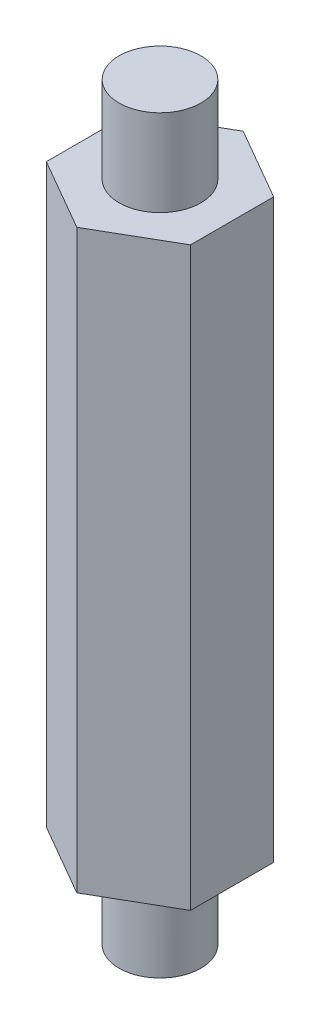
ISO-10303-21;
HEADER;
FILE_DESCRIPTION(('STEP AP214'),'2;1');
FILE_NAME('part.step','',(''),(''),'','','');
FILE_SCHEMA(('AUTOMOTIVE_DESIGN { 1 0 10303 214 1 1 1 1 }'));
ENDSEC;
DATA;
#1=APPLICATION_CONTEXT('core data for automotive mechanical design processes');
#2=APPLICATION_PROTOCOL_DEFINITION('international standard','automotive_design',2000,#1);
#3=PRODUCT_CONTEXT('',#1,'mechanical');
#4=PRODUCT('Part','Part','',(#3));
#5=PRODUCT_RELATED_PRODUCT_CATEGORY('part','',(#4));
#6=PRODUCT_DEFINITION_FORMATION('','',#4);
#7=PRODUCT_DEFINITION_CONTEXT('part definition',#1,'design');
#8=PRODUCT_DEFINITION('design','',#6,#7);
#9=PRODUCT_DEFINITION_SHAPE('','',#8);
#10=(LENGTH_UNIT() NAMED_UNIT(*) SI_UNIT(.MILLI.,.METRE.));
#11=(NAMED_UNIT(*) PLANE_ANGLE_UNIT() SI_UNIT($,.RADIAN.));
#12=(NAMED_UNIT(*) SI_UNIT($,.STERADIAN.) SOLID_ANGLE_UNIT());
#13=UNCERTAINTY_MEASURE_WITH_UNIT(LENGTH_MEASURE(1.E-05),#10,'distance_accuracy_value','');
#14=(GEOMETRIC_REPRESENTATION_CONTEXT(3) GLOBAL_UNCERTAINTY_ASSIGNED_CONTEXT((#13)) GLOBAL_UNIT_ASSIGNED_CONTEXT((#10,
#11,#12)) REPRESENTATION_CONTEXT('',''));
#15=CARTESIAN_POINT('',(0.,0.,0.));
#16=DIRECTION('',(0.,0.,1.));
#17=DIRECTION('',(1.,0.,0.));
#18=AXIS2_PLACEMENT_3D('',#15,#16,#17);
#19=CARTESIAN_POINT('',(2.5,20.,-1.44337567297406));
#20=DIRECTION('',(-0.5,0.,0.866025403784438));
#21=DIRECTION('',(0.866025403784439,0.,0.5));
#22=AXIS2_PLACEMENT_3D('',#19,#20,#21);
#23=PLANE('',#22);
#24=DIRECTION('',(-0.866025403784439,0.,-0.5));
#25=VECTOR('',#24,1.);
#26=CARTESIAN_POINT('',(2.5,0.,-1.44337567297406));
#27=LINE('',#26,#25);
#28=CARTESIAN_POINT('',(2.5,0.,-1.44337567297406));
#29=VERTEX_POINT('',#28);
#30=CARTESIAN_POINT('',(0.,0.,-2.88675134594813));
#31=VERTEX_POINT('',#30);
#32=EDGE_CURVE('E121',#29,#31,#27,.T.);
#33=ORIENTED_EDGE('',*,*,#32,.T.);
#34=DIRECTION('',(0.,-1.,0.));
#35=VECTOR('',#34,1.);
#36=CARTESIAN_POINT('',(0.,20.,-2.88675134594813));
#37=LINE('',#36,#35);
#38=CARTESIAN_POINT('',(0.,20.,-2.88675134594813));
#39=VERTEX_POINT('',#38);
#40=EDGE_CURVE('E44',#39,#31,#37,.T.);
#41=ORIENTED_EDGE('',*,*,#40,.F.);
#42=DIRECTION('',(-0.866025403784439,0.,-0.5));
#43=VECTOR('',#42,1.);
#44=CARTESIAN_POINT('',(2.5,20.,-1.44337567297406));
#45=LINE('',#44,#43);
#46=CARTESIAN_POINT('',(2.5,20.,-1.44337567297406));
#47=VERTEX_POINT('',#46);
#48=EDGE_CURVE('E132',#47,#39,#45,.T.);
#49=ORIENTED_EDGE('',*,*,#48,.F.);
#50=DIRECTION('',(0.,-1.,0.));
#51=VECTOR('',#50,1.);
#52=CARTESIAN_POINT('',(2.5,20.,-1.44337567297406));
#53=LINE('',#52,#51);
#54=EDGE_CURVE('E117',#47,#29,#53,.T.);
#55=ORIENTED_EDGE('',*,*,#54,.T.);
#56=EDGE_LOOP('',(#33,#41,#49,#55));
#57=FACE_BOUND('',#56,.T.);
#58=ADVANCED_FACE('F36',(#57),#23,.F.);
#59=CARTESIAN_POINT('',(0.,20.,-2.88675134594813));
#60=DIRECTION('',(0.5,0.,0.866025403784439));
#61=DIRECTION('',(0.866025403784439,0.,-0.5));
#62=AXIS2_PLACEMENT_3D('',#59,#60,#61);
#63=PLANE('',#62);
#64=DIRECTION('',(-0.866025403784439,0.,0.5));
#65=VECTOR('',#64,1.);
#66=CARTESIAN_POINT('',(0.,0.,-2.88675134594813));
#67=LINE('',#66,#65);
#68=CARTESIAN_POINT('',(-2.5,0.,-1.44337567297407));
#69=VERTEX_POINT('',#68);
#70=EDGE_CURVE('E124',#31,#69,#67,.T.);
#71=ORIENTED_EDGE('',*,*,#70,.T.);
#72=DIRECTION('',(0.,-1.,0.));
#73=VECTOR('',#72,1.);
#74=CARTESIAN_POINT('',(-2.5,20.,-1.44337567297407));
#75=LINE('',#74,#73);
#76=CARTESIAN_POINT('',(-2.5,20.,-1.44337567297407));
#77=VERTEX_POINT('',#76);
#78=EDGE_CURVE('E136',#77,#69,#75,.T.);
#79=ORIENTED_EDGE('',*,*,#78,.F.);
#80=DIRECTION('',(-0.866025403784439,0.,0.5));
#81=VECTOR('',#80,1.);
#82=CARTESIAN_POINT('',(0.,20.,-2.88675134594813));
#83=LINE('',#82,#81);
#84=EDGE_CURVE('E90',#39,#77,#83,.T.);
#85=ORIENTED_EDGE('',*,*,#84,.F.);
#86=ORIENTED_EDGE('',*,*,#40,.T.);
#87=EDGE_LOOP('',(#71,#79,#85,#86));
#88=FACE_BOUND('',#87,.T.);
#89=ADVANCED_FACE('F139',(#88),#63,.F.);
#90=CARTESIAN_POINT('',(-2.5,20.,-1.44337567297407));
#91=DIRECTION('',(1.,0.,0.));
#92=DIRECTION('',(0.,0.,-1.));
#93=AXIS2_PLACEMENT_3D('',#90,#91,#92);
#94=PLANE('',#93);
#95=DIRECTION('',(0.,0.,1.));
#96=VECTOR('',#95,1.);
#97=CARTESIAN_POINT('',(-2.5,0.,-1.44337567297407));
#98=LINE('',#97,#96);
#99=CARTESIAN_POINT('',(-2.5,0.,1.44337567297406));
#100=VERTEX_POINT('',#99);
#101=EDGE_CURVE('E127',#69,#100,#98,.T.);
#102=ORIENTED_EDGE('',*,*,#101,.T.);
#103=DIRECTION('',(0.,-1.,0.));
#104=VECTOR('',#103,1.);
#105=CARTESIAN_POINT('',(-2.5,20.,1.44337567297406));
#106=LINE('',#105,#104);
#107=CARTESIAN_POINT('',(-2.5,20.,1.44337567297406));
#108=VERTEX_POINT('',#107);
#109=EDGE_CURVE('E112',#108,#100,#106,.T.);
#110=ORIENTED_EDGE('',*,*,#109,.F.);
#111=DIRECTION('',(0.,0.,1.));
#112=VECTOR('',#111,1.);
#113=CARTESIAN_POINT('',(-2.5,20.,-1.44337567297407));
#114=LINE('',#113,#112);
#115=EDGE_CURVE('E103',#77,#108,#114,.T.);
#116=ORIENTED_EDGE('',*,*,#115,.F.);
#117=ORIENTED_EDGE('',*,*,#78,.T.);
#118=EDGE_LOOP('',(#102,#110,#116,#117));
#119=FACE_BOUND('',#118,.T.);
#120=ADVANCED_FACE('F147',(#119),#94,.F.);
#121=CARTESIAN_POINT('',(-2.5,20.,1.44337567297406));
#122=DIRECTION('',(0.5,0.,-0.866025403784439));
#123=DIRECTION('',(-0.866025403784439,0.,-0.5));
#124=AXIS2_PLACEMENT_3D('',#121,#122,#123);
#125=PLANE('',#124);
#126=DIRECTION('',(0.866025403784439,0.,0.5));
#127=VECTOR('',#126,1.);
#128=CARTESIAN_POINT('',(-2.5,0.,1.44337567297406));
#129=LINE('',#128,#127);
#130=CARTESIAN_POINT('',(0.,0.,2.88675134594813));
#131=VERTEX_POINT('',#130);
#132=EDGE_CURVE('E111',#100,#131,#129,.T.);
#133=ORIENTED_EDGE('',*,*,#132,.T.);
#134=DIRECTION('',(0.,-1.,0.));
#135=VECTOR('',#134,1.);
#136=CARTESIAN_POINT('',(0.,20.,2.88675134594813));
#137=LINE('',#136,#135);
#138=CARTESIAN_POINT('',(0.,20.,2.88675134594813));
#139=VERTEX_POINT('',#138);
#140=EDGE_CURVE('E108',#139,#131,#137,.T.);
#141=ORIENTED_EDGE('',*,*,#140,.F.);
#142=DIRECTION('',(0.866025403784439,0.,0.5));
#143=VECTOR('',#142,1.);
#144=CARTESIAN_POINT('',(-2.5,20.,1.44337567297406));
#145=LINE('',#144,#143);
#146=EDGE_CURVE('E97',#108,#139,#145,.T.);
#147=ORIENTED_EDGE('',*,*,#146,.F.);
#148=ORIENTED_EDGE('',*,*,#109,.T.);
#149=EDGE_LOOP('',(#133,#141,#147,#148));
#150=FACE_BOUND('',#149,.T.);
#151=ADVANCED_FACE('F109',(#150),#125,.F.);
#152=CARTESIAN_POINT('',(0.,20.,2.88675134594813));
#153=DIRECTION('',(-0.5,0.,-0.866025403784439));
#154=DIRECTION('',(-0.866025403784439,0.,0.5));
#155=AXIS2_PLACEMENT_3D('',#152,#153,#154);
#156=PLANE('',#155);
#157=DIRECTION('',(0.866025403784439,0.,-0.5));
#158=VECTOR('',#157,1.);
#159=CARTESIAN_POINT('',(0.,0.,2.88675134594813));
#160=LINE('',#159,#158);
#161=CARTESIAN_POINT('',(2.5,0.,1.44337567297407));
#162=VERTEX_POINT('',#161);
#163=EDGE_CURVE('E75',#131,#162,#160,.T.);
#164=ORIENTED_EDGE('',*,*,#163,.T.);
#165=DIRECTION('',(0.,-1.,0.));
#166=VECTOR('',#165,1.);
#167=CARTESIAN_POINT('',(2.5,20.,1.44337567297407));
#168=LINE('',#167,#166);
#169=CARTESIAN_POINT('',(2.5,20.,1.44337567297407));
#170=VERTEX_POINT('',#169);
#171=EDGE_CURVE('E113',#170,#162,#168,.T.);
#172=ORIENTED_EDGE('',*,*,#171,.F.);
#173=DIRECTION('',(0.866025403784439,0.,-0.5));
#174=VECTOR('',#173,1.);
#175=CARTESIAN_POINT('',(0.,20.,2.88675134594813));
#176=LINE('',#175,#174);
#177=EDGE_CURVE('E101',#139,#170,#176,.T.);
#178=ORIENTED_EDGE('',*,*,#177,.F.);
#179=ORIENTED_EDGE('',*,*,#140,.T.);
#180=EDGE_LOOP('',(#164,#172,#178,#179));
#181=FACE_BOUND('',#180,.T.);
#182=ADVANCED_FACE('F115',(#181),#156,.F.);
#183=CARTESIAN_POINT('',(2.5,20.,1.44337567297407));
#184=DIRECTION('',(-1.,0.,0.));
#185=DIRECTION('',(0.,0.,1.));
#186=AXIS2_PLACEMENT_3D('',#183,#184,#185);
#187=PLANE('',#186);
#188=DIRECTION('',(0.,0.,-1.));
#189=VECTOR('',#188,1.);
#190=CARTESIAN_POINT('',(2.5,0.,1.44337567297407));
#191=LINE('',#190,#189);
#192=EDGE_CURVE('E81',#162,#29,#191,.T.);
#193=ORIENTED_EDGE('',*,*,#192,.T.);
#194=ORIENTED_EDGE('',*,*,#54,.F.);
#195=DIRECTION('',(0.,0.,-1.));
#196=VECTOR('',#195,1.);
#197=CARTESIAN_POINT('',(2.5,20.,1.44337567297407));
#198=LINE('',#197,#196);
#199=EDGE_CURVE('E52',#170,#47,#198,.T.);
#200=ORIENTED_EDGE('',*,*,#199,.F.);
#201=ORIENTED_EDGE('',*,*,#171,.T.);
#202=EDGE_LOOP('',(#193,#194,#200,#201));
#203=FACE_BOUND('',#202,.T.);
#204=ADVANCED_FACE('F178',(#203),#187,.F.);
#205=CARTESIAN_POINT('',(0.,20.,0.));
#206=DIRECTION('',(0.,1.,0.));
#207=DIRECTION('',(0.,0.,1.));
#208=AXIS2_PLACEMENT_3D('',#205,#206,#207);
#209=PLANE('',#208);
#210=CARTESIAN_POINT('',(0.,20.,0.));
#211=DIRECTION('',(0.,1.,0.));
#212=DIRECTION('',(0.,0.,1.));
#213=AXIS2_PLACEMENT_3D('',#210,#211,#212);
#214=CIRCLE('',#213,1.42);
#215=CARTESIAN_POINT('',(0.,20.,1.42));
#216=VERTEX_POINT('',#215);
#217=EDGE_CURVE('E151',#216,#216,#214,.T.);
#218=ORIENTED_EDGE('',*,*,#217,.F.);
#219=EDGE_LOOP('',(#218));
#220=FACE_BOUND('',#219,.T.);
#221=ORIENTED_EDGE('',*,*,#48,.T.);
#222=ORIENTED_EDGE('',*,*,#84,.T.);
#223=ORIENTED_EDGE('',*,*,#115,.T.);
#224=ORIENTED_EDGE('',*,*,#146,.T.);
#225=ORIENTED_EDGE('',*,*,#177,.T.);
#226=ORIENTED_EDGE('',*,*,#199,.T.);
#227=EDGE_LOOP('',(#221,#222,#223,#224,#225,#226));
#228=FACE_BOUND('',#227,.T.);
#229=ADVANCED_FACE('F99',(#220,#228),#209,.T.);
#230=CARTESIAN_POINT('',(0.,0.,0.));
#231=DIRECTION('',(0.,1.,0.));
#232=DIRECTION('',(0.,0.,1.));
#233=AXIS2_PLACEMENT_3D('',#230,#231,#232);
#234=PLANE('',#233);
#235=CARTESIAN_POINT('',(0.,0.,0.));
#236=DIRECTION('',(0.,1.,0.));
#237=DIRECTION('',(0.,0.,1.));
#238=AXIS2_PLACEMENT_3D('',#235,#236,#237);
#239=CIRCLE('',#238,1.42);
#240=CARTESIAN_POINT('',(0.,0.,1.42));
#241=VERTEX_POINT('',#240);
#242=EDGE_CURVE('E11',#241,#241,#239,.F.);
#243=ORIENTED_EDGE('',*,*,#242,.F.);
#244=EDGE_LOOP('',(#243));
#245=FACE_BOUND('',#244,.T.);
#246=ORIENTED_EDGE('',*,*,#32,.F.);
#247=ORIENTED_EDGE('',*,*,#192,.F.);
#248=ORIENTED_EDGE('',*,*,#163,.F.);
#249=ORIENTED_EDGE('',*,*,#132,.F.);
#250=ORIENTED_EDGE('',*,*,#101,.F.);
#251=ORIENTED_EDGE('',*,*,#70,.F.);
#252=EDGE_LOOP('',(#246,#247,#248,#249,#250,#251));
#253=FACE_BOUND('',#252,.T.);
#254=ADVANCED_FACE('F144',(#245,#253),#234,.F.);
#255=CARTESIAN_POINT('',(0.,23.,0.));
#256=DIRECTION('',(0.,-1.,0.));
#257=DIRECTION('',(0.,0.,-1.));
#258=AXIS2_PLACEMENT_3D('',#255,#256,#257);
#259=CYLINDRICAL_SURFACE('',#258,1.42);
#260=CARTESIAN_POINT('',(0.,23.,0.));
#261=DIRECTION('',(0.,1.,0.));
#262=DIRECTION('',(0.,0.,1.));
#263=AXIS2_PLACEMENT_3D('',#260,#261,#262);
#264=CIRCLE('',#263,1.42);
#265=CARTESIAN_POINT('',(0.,23.,1.42));
#266=VERTEX_POINT('',#265);
#267=EDGE_CURVE('E125',#266,#266,#264,.T.);
#268=ORIENTED_EDGE('',*,*,#267,.F.);
#269=EDGE_LOOP('',(#268));
#270=FACE_BOUND('',#269,.T.);
#271=ORIENTED_EDGE('',*,*,#217,.T.);
#272=EDGE_LOOP('',(#271));
#273=FACE_BOUND('',#272,.T.);
#274=ADVANCED_FACE('F170',(#270,#273),#259,.T.);
#275=CARTESIAN_POINT('',(0.,23.,0.));
#276=DIRECTION('',(0.,1.,0.));
#277=DIRECTION('',(0.,0.,1.));
#278=AXIS2_PLACEMENT_3D('',#275,#276,#277);
#279=PLANE('',#278);
#280=ORIENTED_EDGE('',*,*,#267,.T.);
#281=EDGE_LOOP('',(#280));
#282=FACE_BOUND('',#281,.T.);
#283=ADVANCED_FACE('F165',(#282),#279,.T.);
#284=CARTESIAN_POINT('',(0.,-3.,0.));
#285=DIRECTION('',(0.,1.,0.));
#286=DIRECTION('',(0.,0.,1.));
#287=AXIS2_PLACEMENT_3D('',#284,#285,#286);
#288=CYLINDRICAL_SURFACE('',#287,1.42);
#289=CARTESIAN_POINT('',(0.,-3.,0.));
#290=DIRECTION('',(0.,-1.,0.));
#291=DIRECTION('',(0.,0.,-1.));
#292=AXIS2_PLACEMENT_3D('',#289,#290,#291);
#293=CIRCLE('',#292,1.42);
#294=CARTESIAN_POINT('',(0.,-3.,-1.42));
#295=VERTEX_POINT('',#294);
#296=EDGE_CURVE('E154',#295,#295,#293,.T.);
#297=ORIENTED_EDGE('',*,*,#296,.F.);
#298=EDGE_LOOP('',(#297));
#299=FACE_BOUND('',#298,.T.);
#300=ORIENTED_EDGE('',*,*,#242,.T.);
#301=EDGE_LOOP('',(#300));
#302=FACE_BOUND('',#301,.T.);
#303=ADVANCED_FACE('F162',(#299,#302),#288,.T.);
#304=CARTESIAN_POINT('',(0.,-3.,0.));
#305=DIRECTION('',(0.,-1.,0.));
#306=DIRECTION('',(0.,0.,-1.));
#307=AXIS2_PLACEMENT_3D('',#304,#305,#306);
#308=PLANE('',#307);
#309=ORIENTED_EDGE('',*,*,#296,.T.);
#310=EDGE_LOOP('',(#309));
#311=FACE_BOUND('',#310,.T.);
#312=ADVANCED_FACE('F160',(#311),#308,.T.);
#313=CLOSED_SHELL('',(#58,#89,#120,#151,#182,#204,#229,#254,#274,#283,#303,#312));
#314=MANIFOLD_SOLID_BREP('B2',#313);
#315=ADVANCED_BREP_SHAPE_REPRESENTATION('',(#18,#314),#14);
#316=SHAPE_DEFINITION_REPRESENTATION(#9,#315);
ENDSEC;
END-ISO-10303-21;
